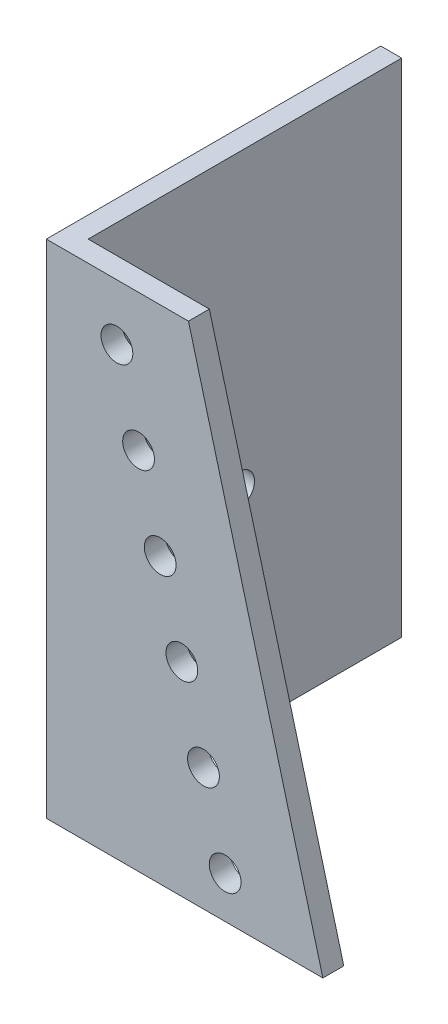
ISO-10303-21;
HEADER;
FILE_DESCRIPTION(('STEP AP214'),'2;1');
FILE_NAME('part.step','',(''),(''),'','','');
FILE_SCHEMA(('AUTOMOTIVE_DESIGN { 1 0 10303 214 1 1 1 1 }'));
ENDSEC;
DATA;
#1=APPLICATION_CONTEXT('core data for automotive mechanical design processes');
#2=APPLICATION_PROTOCOL_DEFINITION('international standard','automotive_design',2000,#1);
#3=PRODUCT_CONTEXT('',#1,'mechanical');
#4=PRODUCT('Part','Part','',(#3));
#5=PRODUCT_RELATED_PRODUCT_CATEGORY('part','',(#4));
#6=PRODUCT_DEFINITION_FORMATION('','',#4);
#7=PRODUCT_DEFINITION_CONTEXT('part definition',#1,'design');
#8=PRODUCT_DEFINITION('design','',#6,#7);
#9=PRODUCT_DEFINITION_SHAPE('','',#8);
#10=(LENGTH_UNIT() NAMED_UNIT(*) SI_UNIT(.MILLI.,.METRE.));
#11=(NAMED_UNIT(*) PLANE_ANGLE_UNIT() SI_UNIT($,.RADIAN.));
#12=(NAMED_UNIT(*) SI_UNIT($,.STERADIAN.) SOLID_ANGLE_UNIT());
#13=UNCERTAINTY_MEASURE_WITH_UNIT(LENGTH_MEASURE(1.E-05),#10,'distance_accuracy_value','');
#14=(GEOMETRIC_REPRESENTATION_CONTEXT(3) GLOBAL_UNCERTAINTY_ASSIGNED_CONTEXT((#13)) GLOBAL_UNIT_ASSIGNED_CONTEXT((#10,
#11,#12)) REPRESENTATION_CONTEXT('',''));
#15=CARTESIAN_POINT('',(0.,0.,0.));
#16=DIRECTION('',(0.,0.,1.));
#17=DIRECTION('',(1.,0.,0.));
#18=AXIS2_PLACEMENT_3D('',#15,#16,#17);
#19=CARTESIAN_POINT('',(50.8,76.2,0.));
#20=DIRECTION('',(0.,0.,-1.));
#21=DIRECTION('',(-1.,0.,0.));
#22=AXIS2_PLACEMENT_3D('',#19,#20,#21);
#23=PLANE('',#22);
#24=CARTESIAN_POINT('',(17.2972379817,43.1517739816135,0.));
#25=DIRECTION('',(0.,0.,-1.));
#26=DIRECTION('',(-1.,0.,0.));
#27=AXIS2_PLACEMENT_3D('',#24,#25,#26);
#28=CIRCLE('',#27,2.41299999999999);
#29=CARTESIAN_POINT('',(14.8842379817,43.1517739816135,0.));
#30=VERTEX_POINT('',#29);
#31=EDGE_CURVE('E195',#30,#30,#28,.T.);
#32=ORIENTED_EDGE('',*,*,#31,.T.);
#33=EDGE_LOOP('',(#32));
#34=FACE_BOUND('',#33,.T.);
#35=CARTESIAN_POINT('',(20.584239854502,30.8845159877423,0.));
#36=DIRECTION('',(0.,0.,-1.));
#37=DIRECTION('',(-1.,0.,0.));
#38=AXIS2_PLACEMENT_3D('',#35,#36,#37);
#39=CIRCLE('',#38,2.413);
#40=CARTESIAN_POINT('',(18.1712398545021,30.8845159877423,0.));
#41=VERTEX_POINT('',#40);
#42=EDGE_CURVE('E188',#41,#41,#39,.T.);
#43=ORIENTED_EDGE('',*,*,#42,.T.);
#44=EDGE_LOOP('',(#43));
#45=FACE_BOUND('',#44,.T.);
#46=CARTESIAN_POINT('',(23.8712417273041,18.6172579938711,0.));
#47=DIRECTION('',(0.,0.,-1.));
#48=DIRECTION('',(-1.,0.,0.));
#49=AXIS2_PLACEMENT_3D('',#46,#47,#48);
#50=CIRCLE('',#49,2.413);
#51=CARTESIAN_POINT('',(21.4582417273041,18.6172579938711,0.));
#52=VERTEX_POINT('',#51);
#53=EDGE_CURVE('E180',#52,#52,#50,.T.);
#54=ORIENTED_EDGE('',*,*,#53,.T.);
#55=EDGE_LOOP('',(#54));
#56=FACE_BOUND('',#55,.T.);
#57=CARTESIAN_POINT('',(14.0102361088979,55.4190319754846,0.));
#58=DIRECTION('',(0.,0.,-1.));
#59=DIRECTION('',(-1.,0.,0.));
#60=AXIS2_PLACEMENT_3D('',#57,#58,#59);
#61=CIRCLE('',#60,2.41299999999999);
#62=CARTESIAN_POINT('',(11.5972361088979,55.4190319754846,0.));
#63=VERTEX_POINT('',#62);
#64=EDGE_CURVE('E172',#63,#63,#61,.T.);
#65=ORIENTED_EDGE('',*,*,#64,.T.);
#66=EDGE_LOOP('',(#65));
#67=FACE_BOUND('',#66,.T.);
#68=CARTESIAN_POINT('',(10.7232342360958,67.6862899693558,0.));
#69=DIRECTION('',(0.,0.,-1.));
#70=DIRECTION('',(-1.,0.,0.));
#71=AXIS2_PLACEMENT_3D('',#68,#69,#70);
#72=CIRCLE('',#71,2.41299999999999);
#73=CARTESIAN_POINT('',(8.31023423609585,67.6862899693558,0.));
#74=VERTEX_POINT('',#73);
#75=EDGE_CURVE('E334',#74,#74,#72,.T.);
#76=ORIENTED_EDGE('',*,*,#75,.T.);
#77=EDGE_LOOP('',(#76));
#78=FACE_BOUND('',#77,.T.);
#79=CARTESIAN_POINT('',(27.1582436001062,6.35,0.));
#80=DIRECTION('',(0.,0.,-1.));
#81=DIRECTION('',(-1.,0.,0.));
#82=AXIS2_PLACEMENT_3D('',#79,#80,#81);
#83=CIRCLE('',#82,2.41299999999999);
#84=CARTESIAN_POINT('',(24.7452436001062,6.35,0.));
#85=VERTEX_POINT('',#84);
#86=EDGE_CURVE('E137',#85,#85,#83,.T.);
#87=ORIENTED_EDGE('',*,*,#86,.T.);
#88=EDGE_LOOP('',(#87));
#89=FACE_BOUND('',#88,.T.);
#90=DIRECTION('',(1.,0.,0.));
#91=VECTOR('',#90,1.);
#92=CARTESIAN_POINT('',(50.8,0.,0.));
#93=LINE('',#92,#91);
#94=CARTESIAN_POINT('',(0.,0.,0.));
#95=VERTEX_POINT('',#94);
#96=CARTESIAN_POINT('',(42.0077284632519,0.,0.));
#97=VERTEX_POINT('',#96);
#98=EDGE_CURVE('E110',#95,#97,#93,.T.);
#99=ORIENTED_EDGE('',*,*,#98,.T.);
#100=DIRECTION('',(-0.258819045102525,0.965925826289067,0.));
#101=VECTOR('',#100,1.);
#102=CARTESIAN_POINT('',(21.59,76.2,0.));
#103=LINE('',#102,#101);
#104=CARTESIAN_POINT('',(21.59,76.2,0.));
#105=VERTEX_POINT('',#104);
#106=EDGE_CURVE('E53',#97,#105,#103,.T.);
#107=ORIENTED_EDGE('',*,*,#106,.T.);
#108=DIRECTION('',(1.,0.,0.));
#109=VECTOR('',#108,1.);
#110=CARTESIAN_POINT('',(50.8,76.2,0.));
#111=LINE('',#110,#109);
#112=CARTESIAN_POINT('',(0.,76.2,0.));
#113=VERTEX_POINT('',#112);
#114=EDGE_CURVE('E108',#113,#105,#111,.T.);
#115=ORIENTED_EDGE('',*,*,#114,.F.);
#116=DIRECTION('',(0.,-1.,0.));
#117=VECTOR('',#116,1.);
#118=CARTESIAN_POINT('',(0.,76.2,0.));
#119=LINE('',#118,#117);
#120=EDGE_CURVE('E133',#113,#95,#119,.T.);
#121=ORIENTED_EDGE('',*,*,#120,.T.);
#122=EDGE_LOOP('',(#99,#107,#115,#121));
#123=FACE_BOUND('',#122,.T.);
#124=ADVANCED_FACE('F39',(#34,#45,#56,#67,#78,#89,#123),#23,.F.);
#125=CARTESIAN_POINT('',(3.17500000000001,76.2,-3.175));
#126=DIRECTION('',(0.,0.,1.));
#127=DIRECTION('',(1.,0.,0.));
#128=AXIS2_PLACEMENT_3D('',#125,#126,#127);
#129=PLANE('',#128);
#130=CARTESIAN_POINT('',(17.2972379817,43.1517739816135,-3.175));
#131=DIRECTION('',(0.,0.,-1.));
#132=DIRECTION('',(-1.,0.,0.));
#133=AXIS2_PLACEMENT_3D('',#130,#131,#132);
#134=CIRCLE('',#133,2.41299999999999);
#135=CARTESIAN_POINT('',(14.8842379817,43.1517739816135,-3.175));
#136=VERTEX_POINT('',#135);
#137=EDGE_CURVE('E103',#136,#136,#134,.T.);
#138=ORIENTED_EDGE('',*,*,#137,.F.);
#139=EDGE_LOOP('',(#138));
#140=FACE_BOUND('',#139,.T.);
#141=CARTESIAN_POINT('',(20.584239854502,30.8845159877423,-3.175));
#142=DIRECTION('',(0.,0.,-1.));
#143=DIRECTION('',(-1.,0.,0.));
#144=AXIS2_PLACEMENT_3D('',#141,#142,#143);
#145=CIRCLE('',#144,2.413);
#146=CARTESIAN_POINT('',(18.1712398545021,30.8845159877423,-3.175));
#147=VERTEX_POINT('',#146);
#148=EDGE_CURVE('E192',#147,#147,#145,.T.);
#149=ORIENTED_EDGE('',*,*,#148,.F.);
#150=EDGE_LOOP('',(#149));
#151=FACE_BOUND('',#150,.T.);
#152=CARTESIAN_POINT('',(23.8712417273041,18.6172579938711,-3.175));
#153=DIRECTION('',(0.,0.,-1.));
#154=DIRECTION('',(-1.,0.,0.));
#155=AXIS2_PLACEMENT_3D('',#152,#153,#154);
#156=CIRCLE('',#155,2.413);
#157=CARTESIAN_POINT('',(21.4582417273041,18.6172579938711,-3.175));
#158=VERTEX_POINT('',#157);
#159=EDGE_CURVE('E184',#158,#158,#156,.T.);
#160=ORIENTED_EDGE('',*,*,#159,.F.);
#161=EDGE_LOOP('',(#160));
#162=FACE_BOUND('',#161,.T.);
#163=CARTESIAN_POINT('',(14.0102361088979,55.4190319754846,-3.175));
#164=DIRECTION('',(0.,0.,-1.));
#165=DIRECTION('',(-1.,0.,0.));
#166=AXIS2_PLACEMENT_3D('',#163,#164,#165);
#167=CIRCLE('',#166,2.41299999999999);
#168=CARTESIAN_POINT('',(11.5972361088979,55.4190319754846,-3.175));
#169=VERTEX_POINT('',#168);
#170=EDGE_CURVE('E176',#169,#169,#167,.T.);
#171=ORIENTED_EDGE('',*,*,#170,.F.);
#172=EDGE_LOOP('',(#171));
#173=FACE_BOUND('',#172,.T.);
#174=CARTESIAN_POINT('',(10.7232342360958,67.6862899693558,-3.175));
#175=DIRECTION('',(0.,0.,-1.));
#176=DIRECTION('',(-1.,0.,0.));
#177=AXIS2_PLACEMENT_3D('',#174,#175,#176);
#178=CIRCLE('',#177,2.41299999999999);
#179=CARTESIAN_POINT('',(8.31023423609585,67.6862899693558,-3.175));
#180=VERTEX_POINT('',#179);
#181=EDGE_CURVE('E327',#180,#180,#178,.T.);
#182=ORIENTED_EDGE('',*,*,#181,.F.);
#183=EDGE_LOOP('',(#182));
#184=FACE_BOUND('',#183,.T.);
#185=CARTESIAN_POINT('',(27.1582436001062,6.35,-3.175));
#186=DIRECTION('',(0.,0.,-1.));
#187=DIRECTION('',(-1.,0.,0.));
#188=AXIS2_PLACEMENT_3D('',#185,#186,#187);
#189=CIRCLE('',#188,2.41299999999999);
#190=CARTESIAN_POINT('',(24.7452436001062,6.35,-3.175));
#191=VERTEX_POINT('',#190);
#192=EDGE_CURVE('E123',#191,#191,#189,.T.);
#193=ORIENTED_EDGE('',*,*,#192,.F.);
#194=EDGE_LOOP('',(#193));
#195=FACE_BOUND('',#194,.T.);
#196=DIRECTION('',(-1.,0.,0.));
#197=VECTOR('',#196,1.);
#198=CARTESIAN_POINT('',(3.17500000000001,76.2,-3.175));
#199=LINE('',#198,#197);
#200=CARTESIAN_POINT('',(21.59,76.2,-3.175));
#201=VERTEX_POINT('',#200);
#202=CARTESIAN_POINT('',(3.17500000000001,76.2,-3.175));
#203=VERTEX_POINT('',#202);
#204=EDGE_CURVE('E90',#201,#203,#199,.T.);
#205=ORIENTED_EDGE('',*,*,#204,.F.);
#206=DIRECTION('',(-0.258819045102525,0.965925826289067,0.));
#207=VECTOR('',#206,1.);
#208=CARTESIAN_POINT('',(21.59,76.2,-3.175));
#209=LINE('',#208,#207);
#210=CARTESIAN_POINT('',(42.0077284632519,0.,-3.175));
#211=VERTEX_POINT('',#210);
#212=EDGE_CURVE('E101',#211,#201,#209,.T.);
#213=ORIENTED_EDGE('',*,*,#212,.F.);
#214=DIRECTION('',(-1.,0.,0.));
#215=VECTOR('',#214,1.);
#216=CARTESIAN_POINT('',(3.17500000000001,0.,-3.175));
#217=LINE('',#216,#215);
#218=CARTESIAN_POINT('',(3.17500000000001,0.,-3.175));
#219=VERTEX_POINT('',#218);
#220=EDGE_CURVE('E136',#211,#219,#217,.T.);
#221=ORIENTED_EDGE('',*,*,#220,.T.);
#222=DIRECTION('',(0.,-1.,0.));
#223=VECTOR('',#222,1.);
#224=CARTESIAN_POINT('',(3.17500000000001,76.2,-3.175));
#225=LINE('',#224,#223);
#226=EDGE_CURVE('E47',#203,#219,#225,.T.);
#227=ORIENTED_EDGE('',*,*,#226,.F.);
#228=EDGE_LOOP('',(#205,#213,#221,#227));
#229=FACE_BOUND('',#228,.T.);
#230=ADVANCED_FACE('F170',(#140,#151,#162,#173,#184,#195,#229),#129,.F.);
#231=CARTESIAN_POINT('',(3.175,76.2,-50.8));
#232=DIRECTION('',(-1.,0.,0.));
#233=DIRECTION('',(0.,0.,1.));
#234=AXIS2_PLACEMENT_3D('',#231,#232,#233);
#235=PLANE('',#234);
#236=CARTESIAN_POINT('',(3.175,31.75,-13.335));
#237=DIRECTION('',(1.,0.,0.));
#238=DIRECTION('',(0.,0.,-1.));
#239=AXIS2_PLACEMENT_3D('',#236,#237,#238);
#240=CIRCLE('',#239,2.413);
#241=CARTESIAN_POINT('',(3.175,31.75,-15.748));
#242=VERTEX_POINT('',#241);
#243=EDGE_CURVE('E288',#242,#242,#240,.T.);
#244=ORIENTED_EDGE('',*,*,#243,.F.);
#245=EDGE_LOOP('',(#244));
#246=FACE_BOUND('',#245,.T.);
#247=CARTESIAN_POINT('',(3.175,19.05,-26.035));
#248=DIRECTION('',(1.,0.,0.));
#249=DIRECTION('',(0.,0.,-1.));
#250=AXIS2_PLACEMENT_3D('',#247,#248,#249);
#251=CIRCLE('',#250,2.413);
#252=CARTESIAN_POINT('',(3.175,19.05,-28.448));
#253=VERTEX_POINT('',#252);
#254=EDGE_CURVE('E296',#253,#253,#251,.T.);
#255=ORIENTED_EDGE('',*,*,#254,.F.);
#256=EDGE_LOOP('',(#255));
#257=FACE_BOUND('',#256,.T.);
#258=CARTESIAN_POINT('',(3.175,19.05,-13.335));
#259=DIRECTION('',(1.,0.,0.));
#260=DIRECTION('',(0.,0.,-1.));
#261=AXIS2_PLACEMENT_3D('',#258,#259,#260);
#262=CIRCLE('',#261,2.413);
#263=CARTESIAN_POINT('',(3.175,19.05,-15.748));
#264=VERTEX_POINT('',#263);
#265=EDGE_CURVE('E295',#264,#264,#262,.T.);
#266=ORIENTED_EDGE('',*,*,#265,.F.);
#267=EDGE_LOOP('',(#266));
#268=FACE_BOUND('',#267,.T.);
#269=CARTESIAN_POINT('',(3.175,6.35,-26.035));
#270=DIRECTION('',(1.,0.,0.));
#271=DIRECTION('',(0.,0.,-1.));
#272=AXIS2_PLACEMENT_3D('',#269,#270,#271);
#273=CIRCLE('',#272,2.413);
#274=CARTESIAN_POINT('',(3.175,6.35,-28.448));
#275=VERTEX_POINT('',#274);
#276=EDGE_CURVE('E312',#275,#275,#273,.T.);
#277=ORIENTED_EDGE('',*,*,#276,.F.);
#278=EDGE_LOOP('',(#277));
#279=FACE_BOUND('',#278,.T.);
#280=CARTESIAN_POINT('',(3.175,31.75,-26.035));
#281=DIRECTION('',(1.,0.,0.));
#282=DIRECTION('',(0.,0.,-1.));
#283=AXIS2_PLACEMENT_3D('',#280,#281,#282);
#284=CIRCLE('',#283,2.413);
#285=CARTESIAN_POINT('',(3.175,31.75,-28.448));
#286=VERTEX_POINT('',#285);
#287=EDGE_CURVE('E283',#286,#286,#284,.T.);
#288=ORIENTED_EDGE('',*,*,#287,.F.);
#289=EDGE_LOOP('',(#288));
#290=FACE_BOUND('',#289,.T.);
#291=CARTESIAN_POINT('',(3.175,6.35,-13.335));
#292=DIRECTION('',(1.,0.,0.));
#293=DIRECTION('',(0.,0.,-1.));
#294=AXIS2_PLACEMENT_3D('',#291,#292,#293);
#295=CIRCLE('',#294,2.413);
#296=CARTESIAN_POINT('',(3.175,6.35,-15.748));
#297=VERTEX_POINT('',#296);
#298=EDGE_CURVE('E311',#297,#297,#295,.T.);
#299=ORIENTED_EDGE('',*,*,#298,.F.);
#300=EDGE_LOOP('',(#299));
#301=FACE_BOUND('',#300,.T.);
#302=DIRECTION('',(0.,0.,-1.));
#303=VECTOR('',#302,1.);
#304=CARTESIAN_POINT('',(3.175,0.,-50.8));
#305=LINE('',#304,#303);
#306=CARTESIAN_POINT('',(3.175,0.,-50.8));
#307=VERTEX_POINT('',#306);
#308=EDGE_CURVE('E140',#219,#307,#305,.T.);
#309=ORIENTED_EDGE('',*,*,#308,.T.);
#310=DIRECTION('',(0.,-1.,0.));
#311=VECTOR('',#310,1.);
#312=CARTESIAN_POINT('',(3.175,76.2,-50.8));
#313=LINE('',#312,#311);
#314=CARTESIAN_POINT('',(3.175,76.2,-50.8));
#315=VERTEX_POINT('',#314);
#316=EDGE_CURVE('E150',#315,#307,#313,.T.);
#317=ORIENTED_EDGE('',*,*,#316,.F.);
#318=DIRECTION('',(0.,0.,-1.));
#319=VECTOR('',#318,1.);
#320=CARTESIAN_POINT('',(3.175,76.2,-50.8));
#321=LINE('',#320,#319);
#322=EDGE_CURVE('E118',#203,#315,#321,.T.);
#323=ORIENTED_EDGE('',*,*,#322,.F.);
#324=ORIENTED_EDGE('',*,*,#226,.T.);
#325=EDGE_LOOP('',(#309,#317,#323,#324));
#326=FACE_BOUND('',#325,.T.);
#327=ADVANCED_FACE('F158',(#246,#257,#268,#279,#290,#301,#326),#235,.F.);
#328=CARTESIAN_POINT('',(0.,76.2,-50.8));
#329=DIRECTION('',(0.,0.,1.));
#330=DIRECTION('',(1.,0.,0.));
#331=AXIS2_PLACEMENT_3D('',#328,#329,#330);
#332=PLANE('',#331);
#333=DIRECTION('',(-1.,0.,0.));
#334=VECTOR('',#333,1.);
#335=CARTESIAN_POINT('',(0.,0.,-50.8));
#336=LINE('',#335,#334);
#337=CARTESIAN_POINT('',(0.,0.,-50.8));
#338=VERTEX_POINT('',#337);
#339=EDGE_CURVE('E120',#307,#338,#336,.T.);
#340=ORIENTED_EDGE('',*,*,#339,.T.);
#341=DIRECTION('',(0.,-1.,0.));
#342=VECTOR('',#341,1.);
#343=CARTESIAN_POINT('',(0.,76.2,-50.8));
#344=LINE('',#343,#342);
#345=CARTESIAN_POINT('',(0.,76.2,-50.8));
#346=VERTEX_POINT('',#345);
#347=EDGE_CURVE('E147',#346,#338,#344,.T.);
#348=ORIENTED_EDGE('',*,*,#347,.F.);
#349=DIRECTION('',(-1.,0.,0.));
#350=VECTOR('',#349,1.);
#351=CARTESIAN_POINT('',(0.,76.2,-50.8));
#352=LINE('',#351,#350);
#353=EDGE_CURVE('E128',#315,#346,#352,.T.);
#354=ORIENTED_EDGE('',*,*,#353,.F.);
#355=ORIENTED_EDGE('',*,*,#316,.T.);
#356=EDGE_LOOP('',(#340,#348,#354,#355));
#357=FACE_BOUND('',#356,.T.);
#358=ADVANCED_FACE('F167',(#357),#332,.F.);
#359=CARTESIAN_POINT('',(0.,76.2,0.));
#360=DIRECTION('',(1.,0.,0.));
#361=DIRECTION('',(0.,0.,-1.));
#362=AXIS2_PLACEMENT_3D('',#359,#360,#361);
#363=PLANE('',#362);
#364=CARTESIAN_POINT('',(0.,31.75,-13.335));
#365=DIRECTION('',(1.,0.,0.));
#366=DIRECTION('',(0.,0.,-1.));
#367=AXIS2_PLACEMENT_3D('',#364,#365,#366);
#368=CIRCLE('',#367,2.413);
#369=CARTESIAN_POINT('',(0.,31.75,-15.748));
#370=VERTEX_POINT('',#369);
#371=EDGE_CURVE('E300',#370,#370,#368,.T.);
#372=ORIENTED_EDGE('',*,*,#371,.T.);
#373=EDGE_LOOP('',(#372));
#374=FACE_BOUND('',#373,.T.);
#375=CARTESIAN_POINT('',(0.,19.05,-26.035));
#376=DIRECTION('',(1.,0.,0.));
#377=DIRECTION('',(0.,0.,-1.));
#378=AXIS2_PLACEMENT_3D('',#375,#376,#377);
#379=CIRCLE('',#378,2.413);
#380=CARTESIAN_POINT('',(0.,19.05,-28.448));
#381=VERTEX_POINT('',#380);
#382=EDGE_CURVE('E291',#381,#381,#379,.T.);
#383=ORIENTED_EDGE('',*,*,#382,.T.);
#384=EDGE_LOOP('',(#383));
#385=FACE_BOUND('',#384,.T.);
#386=CARTESIAN_POINT('',(0.,19.05,-13.335));
#387=DIRECTION('',(1.,0.,0.));
#388=DIRECTION('',(0.,0.,-1.));
#389=AXIS2_PLACEMENT_3D('',#386,#387,#388);
#390=CIRCLE('',#389,2.413);
#391=CARTESIAN_POINT('',(0.,19.05,-15.748));
#392=VERTEX_POINT('',#391);
#393=EDGE_CURVE('E316',#392,#392,#390,.T.);
#394=ORIENTED_EDGE('',*,*,#393,.T.);
#395=EDGE_LOOP('',(#394));
#396=FACE_BOUND('',#395,.T.);
#397=CARTESIAN_POINT('',(0.,6.35,-26.035));
#398=DIRECTION('',(1.,0.,0.));
#399=DIRECTION('',(0.,0.,-1.));
#400=AXIS2_PLACEMENT_3D('',#397,#398,#399);
#401=CIRCLE('',#400,2.413);
#402=CARTESIAN_POINT('',(0.,6.35,-28.448));
#403=VERTEX_POINT('',#402);
#404=EDGE_CURVE('E307',#403,#403,#401,.T.);
#405=ORIENTED_EDGE('',*,*,#404,.T.);
#406=EDGE_LOOP('',(#405));
#407=FACE_BOUND('',#406,.T.);
#408=CARTESIAN_POINT('',(0.,31.75,-26.035));
#409=DIRECTION('',(1.,0.,0.));
#410=DIRECTION('',(0.,0.,-1.));
#411=AXIS2_PLACEMENT_3D('',#408,#409,#410);
#412=CIRCLE('',#411,2.413);
#413=CARTESIAN_POINT('',(0.,31.75,-28.448));
#414=VERTEX_POINT('',#413);
#415=EDGE_CURVE('E280',#414,#414,#412,.T.);
#416=ORIENTED_EDGE('',*,*,#415,.T.);
#417=EDGE_LOOP('',(#416));
#418=FACE_BOUND('',#417,.T.);
#419=CARTESIAN_POINT('',(0.,6.35,-13.335));
#420=DIRECTION('',(1.,0.,0.));
#421=DIRECTION('',(0.,0.,-1.));
#422=AXIS2_PLACEMENT_3D('',#419,#420,#421);
#423=CIRCLE('',#422,2.413);
#424=CARTESIAN_POINT('',(0.,6.35,-15.748));
#425=VERTEX_POINT('',#424);
#426=EDGE_CURVE('E323',#425,#425,#423,.T.);
#427=ORIENTED_EDGE('',*,*,#426,.T.);
#428=EDGE_LOOP('',(#427));
#429=FACE_BOUND('',#428,.T.);
#430=DIRECTION('',(0.,0.,1.));
#431=VECTOR('',#430,1.);
#432=CARTESIAN_POINT('',(0.,0.,0.));
#433=LINE('',#432,#431);
#434=EDGE_CURVE('E83',#338,#95,#433,.T.);
#435=ORIENTED_EDGE('',*,*,#434,.T.);
#436=ORIENTED_EDGE('',*,*,#120,.F.);
#437=DIRECTION('',(0.,0.,1.));
#438=VECTOR('',#437,1.);
#439=CARTESIAN_POINT('',(0.,76.2,0.));
#440=LINE('',#439,#438);
#441=EDGE_CURVE('E62',#346,#113,#440,.T.);
#442=ORIENTED_EDGE('',*,*,#441,.F.);
#443=ORIENTED_EDGE('',*,*,#347,.T.);
#444=EDGE_LOOP('',(#435,#436,#442,#443));
#445=FACE_BOUND('',#444,.T.);
#446=ADVANCED_FACE('F169',(#374,#385,#396,#407,#418,#429,#445),#363,.F.);
#447=CARTESIAN_POINT('',(0.,76.2,0.));
#448=DIRECTION('',(0.,-1.,0.));
#449=DIRECTION('',(0.,0.,-1.));
#450=AXIS2_PLACEMENT_3D('',#447,#448,#449);
#451=PLANE('',#450);
#452=ORIENTED_EDGE('',*,*,#114,.T.);
#453=DIRECTION('',(0.,0.,-1.));
#454=VECTOR('',#453,1.);
#455=CARTESIAN_POINT('',(21.59,76.2,0.));
#456=LINE('',#455,#454);
#457=EDGE_CURVE('E98',#105,#201,#456,.T.);
#458=ORIENTED_EDGE('',*,*,#457,.T.);
#459=ORIENTED_EDGE('',*,*,#204,.T.);
#460=ORIENTED_EDGE('',*,*,#322,.T.);
#461=ORIENTED_EDGE('',*,*,#353,.T.);
#462=ORIENTED_EDGE('',*,*,#441,.T.);
#463=EDGE_LOOP('',(#452,#458,#459,#460,#461,#462));
#464=FACE_BOUND('',#463,.T.);
#465=ADVANCED_FACE('F113',(#464),#451,.F.);
#466=CARTESIAN_POINT('',(0.,0.,0.));
#467=DIRECTION('',(0.,-1.,0.));
#468=DIRECTION('',(0.,0.,-1.));
#469=AXIS2_PLACEMENT_3D('',#466,#467,#468);
#470=PLANE('',#469);
#471=DIRECTION('',(0.,0.,-1.));
#472=VECTOR('',#471,1.);
#473=CARTESIAN_POINT('',(42.0077284632519,0.,0.));
#474=LINE('',#473,#472);
#475=EDGE_CURVE('E11',#97,#211,#474,.T.);
#476=ORIENTED_EDGE('',*,*,#475,.F.);
#477=ORIENTED_EDGE('',*,*,#98,.F.);
#478=ORIENTED_EDGE('',*,*,#434,.F.);
#479=ORIENTED_EDGE('',*,*,#339,.F.);
#480=ORIENTED_EDGE('',*,*,#308,.F.);
#481=ORIENTED_EDGE('',*,*,#220,.F.);
#482=EDGE_LOOP('',(#476,#477,#478,#479,#480,#481));
#483=FACE_BOUND('',#482,.T.);
#484=ADVANCED_FACE('F164',(#483),#470,.T.);
#485=CARTESIAN_POINT('',(21.59,76.2,0.));
#486=DIRECTION('',(-0.965925826289067,-0.258819045102525,0.));
#487=DIRECTION('',(0.258819045102525,-0.965925826289067,0.));
#488=AXIS2_PLACEMENT_3D('',#485,#486,#487);
#489=PLANE('',#488);
#490=ORIENTED_EDGE('',*,*,#475,.T.);
#491=ORIENTED_EDGE('',*,*,#212,.T.);
#492=ORIENTED_EDGE('',*,*,#457,.F.);
#493=ORIENTED_EDGE('',*,*,#106,.F.);
#494=EDGE_LOOP('',(#490,#491,#492,#493));
#495=FACE_BOUND('',#494,.T.);
#496=ADVANCED_FACE('F99',(#495),#489,.F.);
#497=CARTESIAN_POINT('',(27.1582436001062,6.35,0.));
#498=DIRECTION('',(0.,0.,-1.));
#499=DIRECTION('',(-1.,0.,0.));
#500=AXIS2_PLACEMENT_3D('',#497,#498,#499);
#501=CYLINDRICAL_SURFACE('',#500,2.41299999999999);
#502=ORIENTED_EDGE('',*,*,#86,.F.);
#503=EDGE_LOOP('',(#502));
#504=FACE_BOUND('',#503,.T.);
#505=ORIENTED_EDGE('',*,*,#192,.T.);
#506=EDGE_LOOP('',(#505));
#507=FACE_BOUND('',#506,.T.);
#508=ADVANCED_FACE('F204',(#504,#507),#501,.F.);
#509=CARTESIAN_POINT('',(10.7232342360958,67.6862899693558,0.));
#510=DIRECTION('',(0.,0.,-1.));
#511=DIRECTION('',(-1.,0.,0.));
#512=AXIS2_PLACEMENT_3D('',#509,#510,#511);
#513=CYLINDRICAL_SURFACE('',#512,2.41299999999999);
#514=ORIENTED_EDGE('',*,*,#75,.F.);
#515=EDGE_LOOP('',(#514));
#516=FACE_BOUND('',#515,.T.);
#517=ORIENTED_EDGE('',*,*,#181,.T.);
#518=EDGE_LOOP('',(#517));
#519=FACE_BOUND('',#518,.T.);
#520=ADVANCED_FACE('F229',(#516,#519),#513,.F.);
#521=CARTESIAN_POINT('',(14.0102361088979,55.4190319754846,0.));
#522=DIRECTION('',(0.,0.,-1.));
#523=DIRECTION('',(-1.,0.,0.));
#524=AXIS2_PLACEMENT_3D('',#521,#522,#523);
#525=CYLINDRICAL_SURFACE('',#524,2.41299999999999);
#526=ORIENTED_EDGE('',*,*,#64,.F.);
#527=EDGE_LOOP('',(#526));
#528=FACE_BOUND('',#527,.T.);
#529=ORIENTED_EDGE('',*,*,#170,.T.);
#530=EDGE_LOOP('',(#529));
#531=FACE_BOUND('',#530,.T.);
#532=ADVANCED_FACE('F239',(#528,#531),#525,.F.);
#533=CARTESIAN_POINT('',(23.8712417273041,18.6172579938711,0.));
#534=DIRECTION('',(0.,0.,-1.));
#535=DIRECTION('',(-1.,0.,0.));
#536=AXIS2_PLACEMENT_3D('',#533,#534,#535);
#537=CYLINDRICAL_SURFACE('',#536,2.413);
#538=ORIENTED_EDGE('',*,*,#53,.F.);
#539=EDGE_LOOP('',(#538));
#540=FACE_BOUND('',#539,.T.);
#541=ORIENTED_EDGE('',*,*,#159,.T.);
#542=EDGE_LOOP('',(#541));
#543=FACE_BOUND('',#542,.T.);
#544=ADVANCED_FACE('F235',(#540,#543),#537,.F.);
#545=CARTESIAN_POINT('',(20.584239854502,30.8845159877423,0.));
#546=DIRECTION('',(0.,0.,-1.));
#547=DIRECTION('',(-1.,0.,0.));
#548=AXIS2_PLACEMENT_3D('',#545,#546,#547);
#549=CYLINDRICAL_SURFACE('',#548,2.413);
#550=ORIENTED_EDGE('',*,*,#42,.F.);
#551=EDGE_LOOP('',(#550));
#552=FACE_BOUND('',#551,.T.);
#553=ORIENTED_EDGE('',*,*,#148,.T.);
#554=EDGE_LOOP('',(#553));
#555=FACE_BOUND('',#554,.T.);
#556=ADVANCED_FACE('F231',(#552,#555),#549,.F.);
#557=CARTESIAN_POINT('',(17.2972379817,43.1517739816135,0.));
#558=DIRECTION('',(0.,0.,-1.));
#559=DIRECTION('',(-1.,0.,0.));
#560=AXIS2_PLACEMENT_3D('',#557,#558,#559);
#561=CYLINDRICAL_SURFACE('',#560,2.41299999999999);
#562=ORIENTED_EDGE('',*,*,#31,.F.);
#563=EDGE_LOOP('',(#562));
#564=FACE_BOUND('',#563,.T.);
#565=ORIENTED_EDGE('',*,*,#137,.T.);
#566=EDGE_LOOP('',(#565));
#567=FACE_BOUND('',#566,.T.);
#568=ADVANCED_FACE('F234',(#564,#567),#561,.F.);
#569=CARTESIAN_POINT('',(0.,6.35,-13.335));
#570=DIRECTION('',(1.,0.,0.));
#571=DIRECTION('',(0.,0.,-1.));
#572=AXIS2_PLACEMENT_3D('',#569,#570,#571);
#573=CYLINDRICAL_SURFACE('',#572,2.413);
#574=ORIENTED_EDGE('',*,*,#426,.F.);
#575=EDGE_LOOP('',(#574));
#576=FACE_BOUND('',#575,.T.);
#577=ORIENTED_EDGE('',*,*,#298,.T.);
#578=EDGE_LOOP('',(#577));
#579=FACE_BOUND('',#578,.T.);
#580=ADVANCED_FACE('F245',(#576,#579),#573,.F.);
#581=CARTESIAN_POINT('',(0.,31.75,-26.035));
#582=DIRECTION('',(1.,0.,0.));
#583=DIRECTION('',(0.,0.,-1.));
#584=AXIS2_PLACEMENT_3D('',#581,#582,#583);
#585=CYLINDRICAL_SURFACE('',#584,2.413);
#586=ORIENTED_EDGE('',*,*,#415,.F.);
#587=EDGE_LOOP('',(#586));
#588=FACE_BOUND('',#587,.T.);
#589=ORIENTED_EDGE('',*,*,#287,.T.);
#590=EDGE_LOOP('',(#589));
#591=FACE_BOUND('',#590,.T.);
#592=ADVANCED_FACE('F255',(#588,#591),#585,.F.);
#593=CARTESIAN_POINT('',(0.,6.35,-26.035));
#594=DIRECTION('',(1.,0.,0.));
#595=DIRECTION('',(0.,0.,-1.));
#596=AXIS2_PLACEMENT_3D('',#593,#594,#595);
#597=CYLINDRICAL_SURFACE('',#596,2.413);
#598=ORIENTED_EDGE('',*,*,#404,.F.);
#599=EDGE_LOOP('',(#598));
#600=FACE_BOUND('',#599,.T.);
#601=ORIENTED_EDGE('',*,*,#276,.T.);
#602=EDGE_LOOP('',(#601));
#603=FACE_BOUND('',#602,.T.);
#604=ADVANCED_FACE('F261',(#600,#603),#597,.F.);
#605=CARTESIAN_POINT('',(0.,19.05,-13.335));
#606=DIRECTION('',(1.,0.,0.));
#607=DIRECTION('',(0.,0.,-1.));
#608=AXIS2_PLACEMENT_3D('',#605,#606,#607);
#609=CYLINDRICAL_SURFACE('',#608,2.413);
#610=ORIENTED_EDGE('',*,*,#393,.F.);
#611=EDGE_LOOP('',(#610));
#612=FACE_BOUND('',#611,.T.);
#613=ORIENTED_EDGE('',*,*,#265,.T.);
#614=EDGE_LOOP('',(#613));
#615=FACE_BOUND('',#614,.T.);
#616=ADVANCED_FACE('F257',(#612,#615),#609,.F.);
#617=CARTESIAN_POINT('',(0.,19.05,-26.035));
#618=DIRECTION('',(1.,0.,0.));
#619=DIRECTION('',(0.,0.,-1.));
#620=AXIS2_PLACEMENT_3D('',#617,#618,#619);
#621=CYLINDRICAL_SURFACE('',#620,2.413);
#622=ORIENTED_EDGE('',*,*,#382,.F.);
#623=EDGE_LOOP('',(#622));
#624=FACE_BOUND('',#623,.T.);
#625=ORIENTED_EDGE('',*,*,#254,.T.);
#626=EDGE_LOOP('',(#625));
#627=FACE_BOUND('',#626,.T.);
#628=ADVANCED_FACE('F260',(#624,#627),#621,.F.);
#629=CARTESIAN_POINT('',(0.,31.75,-13.335));
#630=DIRECTION('',(1.,0.,0.));
#631=DIRECTION('',(0.,0.,-1.));
#632=AXIS2_PLACEMENT_3D('',#629,#630,#631);
#633=CYLINDRICAL_SURFACE('',#632,2.413);
#634=ORIENTED_EDGE('',*,*,#371,.F.);
#635=EDGE_LOOP('',(#634));
#636=FACE_BOUND('',#635,.T.);
#637=ORIENTED_EDGE('',*,*,#243,.T.);
#638=EDGE_LOOP('',(#637));
#639=FACE_BOUND('',#638,.T.);
#640=ADVANCED_FACE('F266',(#636,#639),#633,.F.);
#641=CLOSED_SHELL('',(#124,#230,#327,#358,#446,#465,#484,#496,#508,#520,#532,#544,#556,#568,
#580,#592,#604,#616,#628,#640));
#642=MANIFOLD_SOLID_BREP('B2',#641);
#643=ADVANCED_BREP_SHAPE_REPRESENTATION('',(#18,#642),#14);
#644=SHAPE_DEFINITION_REPRESENTATION(#9,#643);
ENDSEC;
END-ISO-10303-21;
